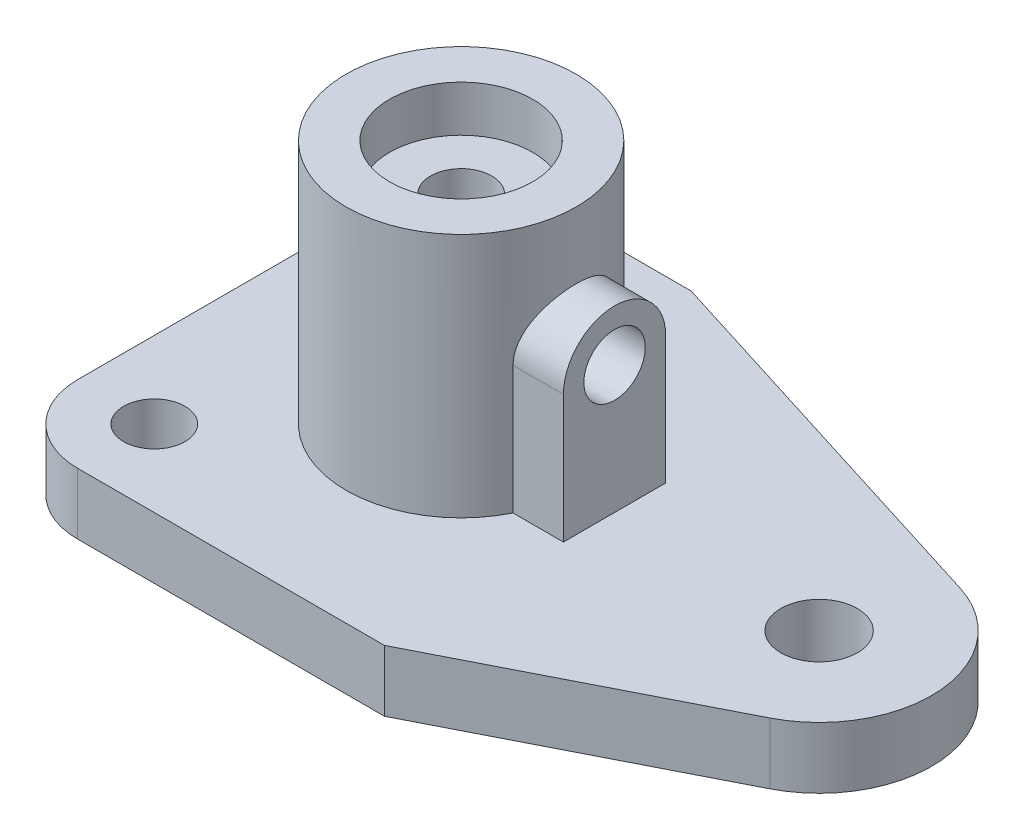
ISO-10303-21;
HEADER;
FILE_DESCRIPTION(('STEP AP214'),'2;1');
FILE_NAME('part.step','',(''),(''),'','','');
FILE_SCHEMA(('AUTOMOTIVE_DESIGN { 1 0 10303 214 1 1 1 1 }'));
ENDSEC;
DATA;
#1=APPLICATION_CONTEXT('core data for automotive mechanical design processes');
#2=APPLICATION_PROTOCOL_DEFINITION('international standard','automotive_design',2000,#1);
#3=PRODUCT_CONTEXT('',#1,'mechanical');
#4=PRODUCT('Part','Part','',(#3));
#5=PRODUCT_RELATED_PRODUCT_CATEGORY('part','',(#4));
#6=PRODUCT_DEFINITION_FORMATION('','',#4);
#7=PRODUCT_DEFINITION_CONTEXT('part definition',#1,'design');
#8=PRODUCT_DEFINITION('design','',#6,#7);
#9=PRODUCT_DEFINITION_SHAPE('','',#8);
#10=(LENGTH_UNIT() NAMED_UNIT(*) SI_UNIT(.MILLI.,.METRE.));
#11=(NAMED_UNIT(*) PLANE_ANGLE_UNIT() SI_UNIT($,.RADIAN.));
#12=(NAMED_UNIT(*) SI_UNIT($,.STERADIAN.) SOLID_ANGLE_UNIT());
#13=UNCERTAINTY_MEASURE_WITH_UNIT(LENGTH_MEASURE(1.E-05),#10,'distance_accuracy_value','');
#14=(GEOMETRIC_REPRESENTATION_CONTEXT(3) GLOBAL_UNCERTAINTY_ASSIGNED_CONTEXT((#13)) GLOBAL_UNIT_ASSIGNED_CONTEXT((#10,
#11,#12)) REPRESENTATION_CONTEXT('',''));
#15=CARTESIAN_POINT('',(0.,0.,0.));
#16=DIRECTION('',(0.,0.,1.));
#17=DIRECTION('',(1.,0.,0.));
#18=AXIS2_PLACEMENT_3D('',#15,#16,#17);
#19=CARTESIAN_POINT('',(-30.,12.,-30.));
#20=DIRECTION('',(0.,1.,0.));
#21=DIRECTION('',(0.,0.,1.));
#22=AXIS2_PLACEMENT_3D('',#19,#20,#21);
#23=PLANE('',#22);
#24=CARTESIAN_POINT('',(-30.,12.,30.));
#25=DIRECTION('',(0.,1.,0.));
#26=DIRECTION('',(0.,0.,1.));
#27=AXIS2_PLACEMENT_3D('',#24,#25,#26);
#28=CIRCLE('',#27,6.);
#29=CARTESIAN_POINT('',(-30.,12.,36.));
#30=VERTEX_POINT('',#29);
#31=EDGE_CURVE('E353',#30,#30,#28,.T.);
#32=ORIENTED_EDGE('',*,*,#31,.F.);
#33=EDGE_LOOP('',(#32));
#34=FACE_BOUND('',#33,.T.);
#35=CARTESIAN_POINT('',(-30.,12.,-30.));
#36=DIRECTION('',(0.,1.,0.));
#37=DIRECTION('',(0.,0.,1.));
#38=AXIS2_PLACEMENT_3D('',#35,#36,#37);
#39=CIRCLE('',#38,15.);
#40=CARTESIAN_POINT('',(-30.,12.,-45.));
#41=VERTEX_POINT('',#40);
#42=CARTESIAN_POINT('',(-45.,12.,-30.));
#43=VERTEX_POINT('',#42);
#44=EDGE_CURVE('E299',#41,#43,#39,.T.);
#45=ORIENTED_EDGE('',*,*,#44,.T.);
#46=DIRECTION('',(0.,0.,1.));
#47=VECTOR('',#46,1.);
#48=CARTESIAN_POINT('',(-45.,12.,-30.));
#49=LINE('',#48,#47);
#50=CARTESIAN_POINT('',(-45.,12.,30.));
#51=VERTEX_POINT('',#50);
#52=EDGE_CURVE('E333',#43,#51,#49,.T.);
#53=ORIENTED_EDGE('',*,*,#52,.T.);
#54=CARTESIAN_POINT('',(-30.,12.,30.));
#55=DIRECTION('',(0.,1.,0.));
#56=DIRECTION('',(0.,0.,1.));
#57=AXIS2_PLACEMENT_3D('',#54,#55,#56);
#58=CIRCLE('',#57,15.);
#59=CARTESIAN_POINT('',(-30.,12.,45.));
#60=VERTEX_POINT('',#59);
#61=EDGE_CURVE('E274',#51,#60,#58,.T.);
#62=ORIENTED_EDGE('',*,*,#61,.T.);
#63=DIRECTION('',(1.,0.,0.));
#64=VECTOR('',#63,1.);
#65=CARTESIAN_POINT('',(-30.,12.,45.));
#66=LINE('',#65,#64);
#67=CARTESIAN_POINT('',(30.,12.,45.));
#68=VERTEX_POINT('',#67);
#69=EDGE_CURVE('E324',#60,#68,#66,.T.);
#70=ORIENTED_EDGE('',*,*,#69,.T.);
#71=DIRECTION('',(0.891526897399263,0.,-0.452967759574171));
#72=VECTOR('',#71,1.);
#73=CARTESIAN_POINT('',(30.,12.,45.));
#74=LINE('',#73,#72);
#75=CARTESIAN_POINT('',(79.9652907106318,12.,19.6135917427838));
#76=VERTEX_POINT('',#75);
#77=EDGE_CURVE('E327',#68,#76,#74,.T.);
#78=ORIENTED_EDGE('',*,*,#77,.T.);
#79=CARTESIAN_POINT('',(70.,12.,0.));
#80=DIRECTION('',(0.,1.,0.));
#81=DIRECTION('',(0.,0.,1.));
#82=AXIS2_PLACEMENT_3D('',#79,#80,#81);
#83=CIRCLE('',#82,22.);
#84=CARTESIAN_POINT('',(76.5809794223601,12.,-20.9926346570046));
#85=VERTEX_POINT('',#84);
#86=EDGE_CURVE('E331',#76,#85,#83,.T.);
#87=ORIENTED_EDGE('',*,*,#86,.T.);
#88=DIRECTION('',(-0.954210666227484,0.,-0.299135428289097));
#89=VECTOR('',#88,1.);
#90=CARTESIAN_POINT('',(0.,12.,-45.));
#91=LINE('',#90,#89);
#92=CARTESIAN_POINT('',(0.,12.,-45.));
#93=VERTEX_POINT('',#92);
#94=EDGE_CURVE('E339',#85,#93,#91,.T.);
#95=ORIENTED_EDGE('',*,*,#94,.T.);
#96=DIRECTION('',(-1.,0.,0.));
#97=VECTOR('',#96,1.);
#98=CARTESIAN_POINT('',(-30.,12.,-45.));
#99=LINE('',#98,#97);
#100=EDGE_CURVE('E305',#93,#41,#99,.T.);
#101=ORIENTED_EDGE('',*,*,#100,.T.);
#102=EDGE_LOOP('',(#45,#53,#62,#70,#78,#87,#95,#101));
#103=FACE_BOUND('',#102,.T.);
#104=CARTESIAN_POINT('',(-30.,12.,-30.));
#105=DIRECTION('',(0.,1.,0.));
#106=DIRECTION('',(0.,0.,1.));
#107=AXIS2_PLACEMENT_3D('',#104,#105,#106);
#108=CIRCLE('',#107,6.);
#109=CARTESIAN_POINT('',(-30.,12.,-24.));
#110=VERTEX_POINT('',#109);
#111=EDGE_CURVE('E344',#110,#110,#108,.T.);
#112=ORIENTED_EDGE('',*,*,#111,.F.);
#113=EDGE_LOOP('',(#112));
#114=FACE_BOUND('',#113,.T.);
#115=CARTESIAN_POINT('',(70.,12.,0.));
#116=DIRECTION('',(0.,1.,0.));
#117=DIRECTION('',(0.,0.,1.));
#118=AXIS2_PLACEMENT_3D('',#115,#116,#117);
#119=CIRCLE('',#118,7.50000000000001);
#120=CARTESIAN_POINT('',(70.,12.,7.50000000000001));
#121=VERTEX_POINT('',#120);
#122=EDGE_CURVE('E413',#121,#121,#119,.T.);
#123=ORIENTED_EDGE('',*,*,#122,.F.);
#124=EDGE_LOOP('',(#123));
#125=FACE_BOUND('',#124,.T.);
#126=DIRECTION('',(0.,0.,-1.));
#127=VECTOR('',#126,1.);
#128=CARTESIAN_POINT('',(30.,12.,-30.));
#129=LINE('',#128,#127);
#130=CARTESIAN_POINT('',(30.,12.,9.99999999999999));
#131=VERTEX_POINT('',#130);
#132=CARTESIAN_POINT('',(30.,12.,-10.));
#133=VERTEX_POINT('',#132);
#134=EDGE_CURVE('E399',#131,#133,#129,.T.);
#135=ORIENTED_EDGE('',*,*,#134,.F.);
#136=DIRECTION('',(-1.,0.,0.));
#137=VECTOR('',#136,1.);
#138=CARTESIAN_POINT('',(-30.,12.,10.));
#139=LINE('',#138,#137);
#140=CARTESIAN_POINT('',(20.1556443707464,12.,10.));
#141=VERTEX_POINT('',#140);
#142=EDGE_CURVE('E372',#131,#141,#139,.T.);
#143=ORIENTED_EDGE('',*,*,#142,.T.);
#144=CARTESIAN_POINT('',(0.,12.,0.));
#145=DIRECTION('',(0.,1.,0.));
#146=DIRECTION('',(0.,0.,1.));
#147=AXIS2_PLACEMENT_3D('',#144,#145,#146);
#148=CIRCLE('',#147,22.5);
#149=CARTESIAN_POINT('',(20.1556443707464,12.,-10.));
#150=VERTEX_POINT('',#149);
#151=EDGE_CURVE('E157',#150,#141,#148,.T.);
#152=ORIENTED_EDGE('',*,*,#151,.F.);
#153=DIRECTION('',(1.,0.,0.));
#154=VECTOR('',#153,1.);
#155=CARTESIAN_POINT('',(-30.,12.,-10.));
#156=LINE('',#155,#154);
#157=EDGE_CURVE('E66',#150,#133,#156,.T.);
#158=ORIENTED_EDGE('',*,*,#157,.T.);
#159=EDGE_LOOP('',(#135,#143,#152,#158));
#160=FACE_BOUND('',#159,.T.);
#161=ADVANCED_FACE('F45',(#34,#103,#114,#125,#160),#23,.T.);
#162=CARTESIAN_POINT('',(0.,60.,0.));
#163=DIRECTION('',(0.,-1.,0.));
#164=DIRECTION('',(0.,0.,-1.));
#165=AXIS2_PLACEMENT_3D('',#162,#163,#164);
#166=CYLINDRICAL_SURFACE('',#165,22.5);
#167=CARTESIAN_POINT('',(0.,60.,0.));
#168=DIRECTION('',(0.,1.,0.));
#169=DIRECTION('',(0.,0.,1.));
#170=AXIS2_PLACEMENT_3D('',#167,#168,#169);
#171=CIRCLE('',#170,22.5);
#172=CARTESIAN_POINT('',(0.,60.,22.5));
#173=VERTEX_POINT('',#172);
#174=EDGE_CURVE('E162',#173,#173,#171,.T.);
#175=ORIENTED_EDGE('',*,*,#174,.F.);
#176=EDGE_LOOP('',(#175));
#177=FACE_BOUND('',#176,.T.);
#178=DIRECTION('',(0.,-1.,0.));
#179=VECTOR('',#178,1.);
#180=CARTESIAN_POINT('',(20.1556443707464,60.,10.));
#181=LINE('',#180,#179);
#182=CARTESIAN_POINT('',(20.1556443707464,37.,10.));
#183=VERTEX_POINT('',#182);
#184=EDGE_CURVE('E141',#183,#141,#181,.T.);
#185=ORIENTED_EDGE('',*,*,#184,.F.);
#186=CARTESIAN_POINT('',(20.1556443707464,37.,10.));
#187=CARTESIAN_POINT('',(20.1556467338138,36.7351067772332,9.99999788988471));
#188=CARTESIAN_POINT('',(20.1608844816626,36.4701410893671,9.9894597057784));
#189=CARTESIAN_POINT('',(20.1816582398332,35.9421708783214,9.94742186521064));
#190=CARTESIAN_POINT('',(20.197200378257,35.67916761639,9.91590973533557));
#191=CARTESIAN_POINT('',(20.2380772267664,35.1567092450034,9.8322123271914));
#192=CARTESIAN_POINT('',(20.2634311556789,34.8972621403407,9.77998647092334));
#193=CARTESIAN_POINT('',(20.3230772541673,34.3841930717982,9.65542798599881));
#194=CARTESIAN_POINT('',(20.3573732206293,34.1305736323055,9.58308681529258));
#195=CARTESIAN_POINT('',(20.4336051796327,33.6321256402333,9.41944147542666));
#196=CARTESIAN_POINT('',(20.4755027058478,33.387259938454,9.32823247178733));
#197=CARTESIAN_POINT('',(20.5657939530483,32.9063770088647,9.12744330969839));
#198=CARTESIAN_POINT('',(20.6141901609393,32.6703632129411,9.01785611429494));
#199=CARTESIAN_POINT('',(20.7670389316288,31.9778259276677,8.66293925993709));
#200=CARTESIAN_POINT('',(20.8792452228439,31.5362284050883,8.39126272338778));
#201=CARTESIAN_POINT('',(21.1204936950509,30.6748444768869,7.76492214778041));
#202=CARTESIAN_POINT('',(21.2501549255516,30.258300073361,7.40603685697128));
#203=CARTESIAN_POINT('',(21.4424229714565,29.6815055479928,6.82019003449962));
#204=CARTESIAN_POINT('',(21.5061859982244,29.497131007946,6.61682725277452));
#205=CARTESIAN_POINT('',(21.6313958255996,29.1454289187576,6.19523871841012));
#206=CARTESIAN_POINT('',(21.69284347198,28.9780951061117,5.97701847636072));
#207=CARTESIAN_POINT('',(21.8149320168583,28.6534417654312,5.5153100191777));
#208=CARTESIAN_POINT('',(21.8753710664174,28.4970715669028,5.27110035790201));
#209=CARTESIAN_POINT('',(21.9902793336661,28.205666076857,4.76905477068004));
#210=CARTESIAN_POINT('',(22.0447510299183,28.0706219171199,4.51122456853914));
#211=CARTESIAN_POINT('',(22.1461792191357,27.8230721031338,3.98357877187223));
#212=CARTESIAN_POINT('',(22.1931369123899,27.7105628484287,3.71376510040366));
#213=CARTESIAN_POINT('',(22.2781493230749,27.509253461446,3.16407617200313));
#214=CARTESIAN_POINT('',(22.3162047614496,27.4204514091725,2.88420173195578));
#215=CARTESIAN_POINT('',(22.3803223524604,27.2720486801381,2.33314810454131));
#216=CARTESIAN_POINT('',(22.4069538802533,27.2110486066769,2.0624117047011));
#217=CARTESIAN_POINT('',(22.4505388982579,27.1116889217879,1.5160434965299));
#218=CARTESIAN_POINT('',(22.4674927326792,27.0733285051265,1.2404118626689));
#219=CARTESIAN_POINT('',(22.4912293486071,27.0197206696435,0.686582910750691));
#220=CARTESIAN_POINT('',(22.4980161435632,27.0044641305162,0.408386648741023));
#221=CARTESIAN_POINT('',(22.5012326015306,26.9972262503561,-0.148362845264709));
#222=CARTESIAN_POINT('',(22.4976627340738,27.0052438541618,-0.426916060505579));
#223=CARTESIAN_POINT('',(22.4808759891807,27.04309082701,-0.962839008842262));
#224=CARTESIAN_POINT('',(22.4683434815083,27.0713731023444,-1.22034125820723));
#225=CARTESIAN_POINT('',(22.434716180397,27.1477076318452,-1.7318160885503));
#226=CARTESIAN_POINT('',(22.4136218604061,27.195758792841,-1.98578886389696));
#227=CARTESIAN_POINT('',(22.3633891330767,27.3111472123243,-2.48850286933622));
#228=CARTESIAN_POINT('',(22.3342504557785,27.3784851180563,-2.73724392355655));
#229=CARTESIAN_POINT('',(22.2686298481087,27.5318074090025,-3.22791060908472));
#230=CARTESIAN_POINT('',(22.2321476833476,27.617792389401,-3.46983602256979));
#231=CARTESIAN_POINT('',(22.152089692032,27.8090945370757,-3.94902407028346));
#232=CARTESIAN_POINT('',(22.1084156511136,27.9146823905874,-4.1861622939866));
#233=CARTESIAN_POINT('',(22.0153912871623,28.1434576528541,-4.65067318854916));
#234=CARTESIAN_POINT('',(21.9660389370878,28.2666513503626,-4.87804233201521));
#235=CARTESIAN_POINT('',(21.8111281064934,28.6612883291605,-5.54361691279589));
#236=CARTESIAN_POINT('',(21.6986645305337,28.9579059801247,-5.9655840826181));
#237=CARTESIAN_POINT('',(21.4560102664737,29.6366892347277,-6.7888322709015));
#238=CARTESIAN_POINT('',(21.3251210231804,30.0237461374228,-7.18588108317837));
#239=CARTESIAN_POINT('',(21.1314622446731,30.6495608251964,-7.72971892231944));
#240=CARTESIAN_POINT('',(21.0673155234338,30.8658547779007,-7.90246830871203));
#241=CARTESIAN_POINT('',(20.9415995919448,31.312599250194,-8.22983006499316));
#242=CARTESIAN_POINT('',(20.8800307166904,31.5430516001475,-8.3844400823172));
#243=CARTESIAN_POINT('',(20.758751421661,32.0267868622747,-8.68049085051104));
#244=CARTESIAN_POINT('',(20.6992275307664,32.2806220739585,-8.82110625775698));
#245=CARTESIAN_POINT('',(20.5868915444071,32.8006544573091,-9.08018899482053));
#246=CARTESIAN_POINT('',(20.5340764882043,33.0668461045243,-9.19866610564587));
#247=CARTESIAN_POINT('',(20.4370265474676,33.60981558618,-9.41231764127191));
#248=CARTESIAN_POINT('',(20.392787919955,33.8865887391473,-9.50750223631645));
#249=CARTESIAN_POINT('',(20.314561946013,34.4487547745452,-9.67352137812284));
#250=CARTESIAN_POINT('',(20.2805735316984,34.7341467556405,-9.74435846155888));
#251=CARTESIAN_POINT('',(20.2262278473527,35.2907597710347,-9.85663803179575));
#252=CARTESIAN_POINT('',(20.2050767139709,35.5615560667722,-9.8998047088277));
#253=CARTESIAN_POINT('',(20.1736108445027,36.1064042812481,-9.96376976967522));
#254=CARTESIAN_POINT('',(20.1632955865235,36.3804560425492,-9.98456923077345));
#255=CARTESIAN_POINT('',(20.1538999545394,36.9294307028715,-10.0035208156396));
#256=CARTESIAN_POINT('',(20.154815377589,37.2043532375104,-10.0016814117259));
#257=CARTESIAN_POINT('',(20.1678360860462,37.7528411180516,-9.97539993080949));
#258=CARTESIAN_POINT('',(20.1799409304055,38.0264065170203,-9.95095874469111));
#259=CARTESIAN_POINT('',(20.2135161213583,38.5488231272236,-9.88256441077222));
#260=CARTESIAN_POINT('',(20.2341874012781,38.7979457426185,-9.84027134984551));
#261=CARTESIAN_POINT('',(20.2840057086,39.2915496882637,-9.73716533443507));
#262=CARTESIAN_POINT('',(20.3131556224998,39.5360294076229,-9.67634607248892));
#263=CARTESIAN_POINT('',(20.3790442512744,40.0187100608811,-9.53679707059548));
#264=CARTESIAN_POINT('',(20.4157815494223,40.2569121575969,-9.45807067401518));
#265=CARTESIAN_POINT('',(20.4958187078979,40.7258548890386,-9.2833530815855));
#266=CARTESIAN_POINT('',(20.5391211448474,40.9565925508632,-9.18735510438002));
#267=CARTESIAN_POINT('',(20.6331633525949,41.4193914368704,-8.97422561510591));
#268=CARTESIAN_POINT('',(20.6841476326031,41.651058389966,-8.85634622667798));
#269=CARTESIAN_POINT('',(20.7906388494777,42.1038333959011,-8.60338132747131));
#270=CARTESIAN_POINT('',(20.8461477571085,42.3249367804073,-8.46828830447006));
#271=CARTESIAN_POINT('',(20.9602630980584,42.7554959091584,-8.18175708328124));
#272=CARTESIAN_POINT('',(21.0188700856417,42.9649495553492,-8.03031595523931));
#273=CARTESIAN_POINT('',(21.1377586527882,43.371230833598,-7.71194097990626));
#274=CARTESIAN_POINT('',(21.1980403200873,43.5680578023538,-7.54500631983705));
#275=CARTESIAN_POINT('',(21.3246451582659,43.9663086857042,-7.17985450750534));
#276=CARTESIAN_POINT('',(21.3909965976262,44.1663830691585,-6.98017224966624));
#277=CARTESIAN_POINT('',(21.5222238804823,44.5490677156752,-6.56440261282672));
#278=CARTESIAN_POINT('',(21.5871001979623,44.7316836506754,-6.34832060301987));
#279=CARTESIAN_POINT('',(21.7137146663014,45.0784576482457,-5.90073781503396));
#280=CARTESIAN_POINT('',(21.7754510028632,45.2426051045567,-5.66922829727787));
#281=CARTESIAN_POINT('',(21.8940700465457,45.5510564581777,-5.19230618617743));
#282=CARTESIAN_POINT('',(21.9509548511344,45.6953689474325,-4.94689967807606));
#283=CARTESIAN_POINT('',(22.0588299139297,45.9642221108373,-4.44132964839999));
#284=CARTESIAN_POINT('',(22.1097634782784,46.0885762693611,-4.1810546398633));
#285=CARTESIAN_POINT('',(22.2036947129601,46.3147543223198,-3.64948960259465));
#286=CARTESIAN_POINT('',(22.2466922459384,46.4165778268063,-3.37819938331353));
#287=CARTESIAN_POINT('',(22.3234599031495,46.5965350810062,-2.82676134304924));
#288=CARTESIAN_POINT('',(22.3572352143356,46.6746821500336,-2.54661860042782));
#289=CARTESIAN_POINT('',(22.4145569743246,46.8064208932378,-1.97959661993668));
#290=CARTESIAN_POINT('',(22.4381043259136,46.8600147346642,-1.692717978978));
#291=CARTESIAN_POINT('',(22.4728339117286,46.9387827905836,-1.1371454999443));
#292=CARTESIAN_POINT('',(22.4848339437628,46.9658397801123,-0.868768220564982));
#293=CARTESIAN_POINT('',(22.49918398273,46.9981745659679,-0.330452856118372));
#294=CARTESIAN_POINT('',(22.5015345151454,47.0034535482587,-0.0605148568448495));
#295=CARTESIAN_POINT('',(22.4965218101386,46.992172799855,0.478757546780382));
#296=CARTESIAN_POINT('',(22.4891604682379,46.9756173307141,0.748092058641848));
#297=CARTESIAN_POINT('',(22.4649286668168,46.9208680363648,1.28411610926064));
#298=CARTESIAN_POINT('',(22.4480583176503,46.8826744622707,1.55080567867646));
#299=CARTESIAN_POINT('',(22.4062221255858,46.7872639904234,2.06771118811459));
#300=CARTESIAN_POINT('',(22.3816514317179,46.7309727494295,2.31813095749895));
#301=CARTESIAN_POINT('',(22.3248320476295,46.5995643638601,2.81317832182088));
#302=CARTESIAN_POINT('',(22.2925806886456,46.5244406751869,3.05780387091359));
#303=CARTESIAN_POINT('',(22.2211700519152,46.3560785174868,3.53961949147704));
#304=CARTESIAN_POINT('',(22.1820125187124,46.2628446226121,3.77681142294876));
#305=CARTESIAN_POINT('',(22.0976591879738,46.058981881588,4.24258216784143));
#306=CARTESIAN_POINT('',(22.0524610878506,45.9483463993155,4.4711576539737));
#307=CARTESIAN_POINT('',(21.9548643697115,45.7051155409264,4.92859841084508));
#308=CARTESIAN_POINT('',(21.9022318232289,45.5717505092174,5.15700447949294));
#309=CARTESIAN_POINT('',(21.7926877628969,45.287846094391,5.60189892080378));
#310=CARTESIAN_POINT('',(21.7357747818329,45.1373008131273,5.818383162544));
#311=CARTESIAN_POINT('',(21.6189883380931,44.8200011252835,6.23833757112253));
#312=CARTESIAN_POINT('',(21.5591143342601,44.6532437503597,6.44180534336791));
#313=CARTESIAN_POINT('',(21.4377882534932,44.3044844240433,6.83472913899957));
#314=CARTESIAN_POINT('',(21.3763360932915,44.122481667114,7.02418442099565));
#315=CARTESIAN_POINT('',(21.2484097974618,43.7292027642688,7.40257086716319));
#316=CARTESIAN_POINT('',(21.1819226765392,43.5167498751481,7.590276755706));
#317=CARTESIAN_POINT('',(21.0506286657676,43.0764384775787,7.94714925759242));
#318=CARTESIAN_POINT('',(20.9858212534637,42.8485848408882,8.11632168970186));
#319=CARTESIAN_POINT('',(20.8596674630556,42.3783883021554,8.43526657622545));
#320=CARTESIAN_POINT('',(20.798324853763,42.1360301912847,8.58501812670279));
#321=CARTESIAN_POINT('',(20.6810875144462,41.6385107408398,8.86371677266268));
#322=CARTESIAN_POINT('',(20.6251903317933,41.383355244408,8.99267325158902));
#323=CARTESIAN_POINT('',(20.5204223278927,40.8605177675275,9.22925198454869));
#324=CARTESIAN_POINT('',(20.4715837641595,40.5927852560896,9.33677709633277));
#325=CARTESIAN_POINT('',(20.3830036854502,40.0477957201805,9.52860613159677));
#326=CARTESIAN_POINT('',(20.3432576156382,39.7705435449444,9.61292168610159));
#327=CARTESIAN_POINT('',(20.2744540432103,39.2092657837237,9.75719704321534));
#328=CARTESIAN_POINT('',(20.2453685035713,38.9252600875445,9.81722077692091));
#329=CARTESIAN_POINT('',(20.1989448055637,38.352312057745,9.91238948185889));
#330=CARTESIAN_POINT('',(20.1815978207776,38.0633736011315,9.94755314668912));
#331=CARTESIAN_POINT('',(20.1655429029449,37.6447393800361,9.98002857488445));
#332=CARTESIAN_POINT('',(20.1618347103411,37.5159423447458,9.98751472602665));
#333=CARTESIAN_POINT('',(20.1568848347925,37.2581026112733,9.99750102092719));
#334=CARTESIAN_POINT('',(20.1556432194249,37.1290599064573,10.0000010280795));
#335=CARTESIAN_POINT('',(20.1556443707464,37.,10.));
#336=B_SPLINE_CURVE_WITH_KNOTS('',3,(#186,#187,#188,#189,#190,#191,#192,#193,#194,#195,#196,
#197,#198,#199,#200,#201,#202,#203,#204,#205,#206,#207,#208,#209,#210,#211,#212,#213,#214,#215,
#216,#217,#218,#219,#220,#221,#222,#223,#224,#225,#226,#227,#228,#229,#230,#231,#232,#233,#234,
#235,#236,#237,#238,#239,#240,#241,#242,#243,#244,#245,#246,#247,#248,#249,#250,#251,#252,#253,
#254,#255,#256,#257,#258,#259,#260,#261,#262,#263,#264,#265,#266,#267,#268,#269,#270,#271,#272,
#273,#274,#275,#276,#277,#278,#279,#280,#281,#282,#283,#284,#285,#286,#287,#288,#289,#290,#291,
#292,#293,#294,#295,#296,#297,#298,#299,#300,#301,#302,#303,#304,#305,#306,#307,#308,#309,#310,
#311,#312,#313,#314,#315,#316,#317,#318,#319,#320,#321,#322,#323,#324,#325,#326,#327,#328,#329,
#330,#331,#332,#333,#334,#335),.UNSPECIFIED.,.T.,.F.,(4,2,2,2,2,2,2,2,2,2,2,2,2,2,2,2,2,2,2,2,2,
2,2,2,2,2,2,2,2,2,2,2,2,2,2,2,2,2,2,2,2,2,2,2,2,2,2,2,2,2,2,2,2,2,2,2,2,2,2,2,2,2,2,2,2,2,2,2,2,
2,2,2,2,2,4),(0.,0.79454598366116,1.58956491441372,2.38614903397939,3.18307194418878,
3.97606927706689,4.76937094238574,6.35414685016742,8.04110114663072,8.8857740316152,
9.73013531874934,10.6176638867956,11.504822407562,12.3918390716068,13.2787838762477,
14.114076963444,14.9493403396452,15.784273907791,16.6191696238023,17.3963151015551,
18.1734176108507,18.9505462020113,19.7276996015083,20.516512623991,21.3056081156004,
22.8828449625342,24.5840413585073,25.4357153849812,26.2874997465144,27.1750428438788,
28.0621928803463,28.9489548653087,29.8356244339034,30.659603228909,31.4835423364619,
32.3071731042592,33.1307714087576,33.8905016124852,34.650490764922,35.4103381392312,
36.1704845067572,36.9643087194601,37.7584805601155,38.5527949667081,39.3471510659663,
40.2172097801006,41.0869848602168,41.9572569208198,42.8271508081118,43.7047523008651,
44.5823689814847,45.4594910331812,46.3365356486669,47.145515439736,47.954451175643,
48.7632290503414,49.5719975392133,50.3446501244681,51.1175715722759,51.8902980541085,
52.6633199340981,53.4714833490813,54.2799250538284,55.0885150595102,55.8971478165159,
56.7697018395645,57.6419811256015,58.5151916438944,59.3880070306056,60.2646929065421,
61.1409386450096,62.0148630483932,62.8881296009241,63.2752335817631,63.6623481679963),.UNSPECIFIED.);
#337=CARTESIAN_POINT('',(20.1556443707464,37.,-10.));
#338=VERTEX_POINT('',#337);
#339=EDGE_CURVE('E174',#338,#183,#336,.T.);
#340=ORIENTED_EDGE('',*,*,#339,.F.);
#341=DIRECTION('',(0.,-1.,0.));
#342=VECTOR('',#341,1.);
#343=CARTESIAN_POINT('',(20.1556443707464,60.,-10.));
#344=LINE('',#343,#342);
#345=EDGE_CURVE('E170',#150,#338,#344,.F.);
#346=ORIENTED_EDGE('',*,*,#345,.F.);
#347=ORIENTED_EDGE('',*,*,#151,.T.);
#348=EDGE_LOOP('',(#185,#340,#346,#347));
#349=FACE_BOUND('',#348,.T.);
#350=ADVANCED_FACE('F183',(#177,#349),#166,.T.);
#351=CARTESIAN_POINT('',(-30.,0.,-30.));
#352=DIRECTION('',(0.,1.,0.));
#353=DIRECTION('',(0.,0.,1.));
#354=AXIS2_PLACEMENT_3D('',#351,#352,#353);
#355=PLANE('',#354);
#356=CARTESIAN_POINT('',(0.,0.,0.));
#357=DIRECTION('',(0.,1.,0.));
#358=DIRECTION('',(0.,0.,1.));
#359=AXIS2_PLACEMENT_3D('',#356,#357,#358);
#360=CIRCLE('',#359,6.00000000000001);
#361=CARTESIAN_POINT('',(0.,0.,6.00000000000001));
#362=VERTEX_POINT('',#361);
#363=EDGE_CURVE('E154',#362,#362,#360,.T.);
#364=ORIENTED_EDGE('',*,*,#363,.T.);
#365=EDGE_LOOP('',(#364));
#366=FACE_BOUND('',#365,.T.);
#367=CARTESIAN_POINT('',(-30.,0.,-30.));
#368=DIRECTION('',(0.,1.,0.));
#369=DIRECTION('',(0.,0.,1.));
#370=AXIS2_PLACEMENT_3D('',#367,#368,#369);
#371=CIRCLE('',#370,15.);
#372=CARTESIAN_POINT('',(-30.,0.,-45.));
#373=VERTEX_POINT('',#372);
#374=CARTESIAN_POINT('',(-45.,0.,-30.));
#375=VERTEX_POINT('',#374);
#376=EDGE_CURVE('E270',#373,#375,#371,.T.);
#377=ORIENTED_EDGE('',*,*,#376,.F.);
#378=DIRECTION('',(-1.,0.,0.));
#379=VECTOR('',#378,1.);
#380=CARTESIAN_POINT('',(-30.,0.,-45.));
#381=LINE('',#380,#379);
#382=CARTESIAN_POINT('',(0.,0.,-45.));
#383=VERTEX_POINT('',#382);
#384=EDGE_CURVE('E296',#383,#373,#381,.T.);
#385=ORIENTED_EDGE('',*,*,#384,.F.);
#386=DIRECTION('',(-0.954210666227484,0.,-0.299135428289097));
#387=VECTOR('',#386,1.);
#388=CARTESIAN_POINT('',(0.,0.,-45.));
#389=LINE('',#388,#387);
#390=CARTESIAN_POINT('',(76.5809794223601,0.,-20.9926346570046));
#391=VERTEX_POINT('',#390);
#392=EDGE_CURVE('E293',#391,#383,#389,.T.);
#393=ORIENTED_EDGE('',*,*,#392,.F.);
#394=CARTESIAN_POINT('',(70.,0.,0.));
#395=DIRECTION('',(0.,1.,0.));
#396=DIRECTION('',(0.,0.,1.));
#397=AXIS2_PLACEMENT_3D('',#394,#395,#396);
#398=CIRCLE('',#397,22.);
#399=CARTESIAN_POINT('',(79.9652907106318,0.,19.6135917427838));
#400=VERTEX_POINT('',#399);
#401=EDGE_CURVE('E290',#400,#391,#398,.T.);
#402=ORIENTED_EDGE('',*,*,#401,.F.);
#403=DIRECTION('',(0.891526897399263,0.,-0.452967759574171));
#404=VECTOR('',#403,1.);
#405=CARTESIAN_POINT('',(30.,0.,45.));
#406=LINE('',#405,#404);
#407=CARTESIAN_POINT('',(30.,0.,45.));
#408=VERTEX_POINT('',#407);
#409=EDGE_CURVE('E284',#408,#400,#406,.T.);
#410=ORIENTED_EDGE('',*,*,#409,.F.);
#411=DIRECTION('',(1.,0.,0.));
#412=VECTOR('',#411,1.);
#413=CARTESIAN_POINT('',(-30.,0.,45.));
#414=LINE('',#413,#412);
#415=CARTESIAN_POINT('',(-30.,0.,45.));
#416=VERTEX_POINT('',#415);
#417=EDGE_CURVE('E280',#416,#408,#414,.T.);
#418=ORIENTED_EDGE('',*,*,#417,.F.);
#419=CARTESIAN_POINT('',(-30.,0.,30.));
#420=DIRECTION('',(0.,1.,0.));
#421=DIRECTION('',(0.,0.,1.));
#422=AXIS2_PLACEMENT_3D('',#419,#420,#421);
#423=CIRCLE('',#422,15.);
#424=CARTESIAN_POINT('',(-45.,0.,30.));
#425=VERTEX_POINT('',#424);
#426=EDGE_CURVE('E269',#425,#416,#423,.T.);
#427=ORIENTED_EDGE('',*,*,#426,.F.);
#428=DIRECTION('',(0.,0.,1.));
#429=VECTOR('',#428,1.);
#430=CARTESIAN_POINT('',(-45.,0.,-30.));
#431=LINE('',#430,#429);
#432=EDGE_CURVE('E259',#375,#425,#431,.T.);
#433=ORIENTED_EDGE('',*,*,#432,.F.);
#434=EDGE_LOOP('',(#377,#385,#393,#402,#410,#418,#427,#433));
#435=FACE_BOUND('',#434,.T.);
#436=CARTESIAN_POINT('',(-30.,0.,-30.));
#437=DIRECTION('',(0.,1.,0.));
#438=DIRECTION('',(0.,0.,1.));
#439=AXIS2_PLACEMENT_3D('',#436,#437,#438);
#440=CIRCLE('',#439,6.);
#441=CARTESIAN_POINT('',(-30.,0.,-24.));
#442=VERTEX_POINT('',#441);
#443=EDGE_CURVE('E347',#442,#442,#440,.T.);
#444=ORIENTED_EDGE('',*,*,#443,.T.);
#445=EDGE_LOOP('',(#444));
#446=FACE_BOUND('',#445,.T.);
#447=CARTESIAN_POINT('',(-30.,0.,30.));
#448=DIRECTION('',(0.,1.,0.));
#449=DIRECTION('',(0.,0.,1.));
#450=AXIS2_PLACEMENT_3D('',#447,#448,#449);
#451=CIRCLE('',#450,6.);
#452=CARTESIAN_POINT('',(-30.,0.,36.));
#453=VERTEX_POINT('',#452);
#454=EDGE_CURVE('E356',#453,#453,#451,.T.);
#455=ORIENTED_EDGE('',*,*,#454,.T.);
#456=EDGE_LOOP('',(#455));
#457=FACE_BOUND('',#456,.T.);
#458=CARTESIAN_POINT('',(70.,0.,0.));
#459=DIRECTION('',(0.,1.,0.));
#460=DIRECTION('',(0.,0.,1.));
#461=AXIS2_PLACEMENT_3D('',#458,#459,#460);
#462=CIRCLE('',#461,7.50000000000001);
#463=CARTESIAN_POINT('',(70.,0.,7.50000000000001));
#464=VERTEX_POINT('',#463);
#465=EDGE_CURVE('E411',#464,#464,#462,.T.);
#466=ORIENTED_EDGE('',*,*,#465,.T.);
#467=EDGE_LOOP('',(#466));
#468=FACE_BOUND('',#467,.T.);
#469=ADVANCED_FACE('F217',(#366,#435,#446,#457,#468),#355,.F.);
#470=CARTESIAN_POINT('',(-30.,12.,-30.));
#471=DIRECTION('',(0.,-1.,0.));
#472=DIRECTION('',(0.,0.,-1.));
#473=AXIS2_PLACEMENT_3D('',#470,#471,#472);
#474=CYLINDRICAL_SURFACE('',#473,15.);
#475=ORIENTED_EDGE('',*,*,#376,.T.);
#476=DIRECTION('',(0.,-1.,0.));
#477=VECTOR('',#476,1.);
#478=CARTESIAN_POINT('',(-45.,12.,-30.));
#479=LINE('',#478,#477);
#480=EDGE_CURVE('E168',#43,#375,#479,.T.);
#481=ORIENTED_EDGE('',*,*,#480,.F.);
#482=ORIENTED_EDGE('',*,*,#44,.F.);
#483=DIRECTION('',(0.,-1.,0.));
#484=VECTOR('',#483,1.);
#485=CARTESIAN_POINT('',(-30.,12.,-45.));
#486=LINE('',#485,#484);
#487=EDGE_CURVE('E300',#41,#373,#486,.T.);
#488=ORIENTED_EDGE('',*,*,#487,.T.);
#489=EDGE_LOOP('',(#475,#481,#482,#488));
#490=FACE_BOUND('',#489,.T.);
#491=ADVANCED_FACE('F47',(#490),#474,.T.);
#492=CARTESIAN_POINT('',(-45.,12.,-30.));
#493=DIRECTION('',(1.,0.,0.));
#494=DIRECTION('',(0.,0.,-1.));
#495=AXIS2_PLACEMENT_3D('',#492,#493,#494);
#496=PLANE('',#495);
#497=ORIENTED_EDGE('',*,*,#432,.T.);
#498=DIRECTION('',(0.,-1.,0.));
#499=VECTOR('',#498,1.);
#500=CARTESIAN_POINT('',(-45.,12.,30.));
#501=LINE('',#500,#499);
#502=EDGE_CURVE('E261',#51,#425,#501,.T.);
#503=ORIENTED_EDGE('',*,*,#502,.F.);
#504=ORIENTED_EDGE('',*,*,#52,.F.);
#505=ORIENTED_EDGE('',*,*,#480,.T.);
#506=EDGE_LOOP('',(#497,#503,#504,#505));
#507=FACE_BOUND('',#506,.T.);
#508=ADVANCED_FACE('F249',(#507),#496,.F.);
#509=CARTESIAN_POINT('',(-30.,12.,30.));
#510=DIRECTION('',(0.,-1.,0.));
#511=DIRECTION('',(0.,0.,-1.));
#512=AXIS2_PLACEMENT_3D('',#509,#510,#511);
#513=CYLINDRICAL_SURFACE('',#512,15.);
#514=ORIENTED_EDGE('',*,*,#426,.T.);
#515=DIRECTION('',(0.,-1.,0.));
#516=VECTOR('',#515,1.);
#517=CARTESIAN_POINT('',(-30.,12.,45.));
#518=LINE('',#517,#516);
#519=EDGE_CURVE('E276',#60,#416,#518,.T.);
#520=ORIENTED_EDGE('',*,*,#519,.F.);
#521=ORIENTED_EDGE('',*,*,#61,.F.);
#522=ORIENTED_EDGE('',*,*,#502,.T.);
#523=EDGE_LOOP('',(#514,#520,#521,#522));
#524=FACE_BOUND('',#523,.T.);
#525=ADVANCED_FACE('F246',(#524),#513,.T.);
#526=CARTESIAN_POINT('',(-30.,12.,45.));
#527=DIRECTION('',(0.,0.,-1.));
#528=DIRECTION('',(-1.,0.,0.));
#529=AXIS2_PLACEMENT_3D('',#526,#527,#528);
#530=PLANE('',#529);
#531=ORIENTED_EDGE('',*,*,#417,.T.);
#532=DIRECTION('',(0.,-1.,0.));
#533=VECTOR('',#532,1.);
#534=CARTESIAN_POINT('',(30.,12.,45.));
#535=LINE('',#534,#533);
#536=EDGE_CURVE('E317',#68,#408,#535,.T.);
#537=ORIENTED_EDGE('',*,*,#536,.F.);
#538=ORIENTED_EDGE('',*,*,#69,.F.);
#539=ORIENTED_EDGE('',*,*,#519,.T.);
#540=EDGE_LOOP('',(#531,#537,#538,#539));
#541=FACE_BOUND('',#540,.T.);
#542=ADVANCED_FACE('F242',(#541),#530,.F.);
#543=CARTESIAN_POINT('',(30.,12.,45.));
#544=DIRECTION('',(-0.452967759574171,0.,-0.891526897399263));
#545=DIRECTION('',(-0.891526897399263,0.,0.452967759574171));
#546=AXIS2_PLACEMENT_3D('',#543,#544,#545);
#547=PLANE('',#546);
#548=ORIENTED_EDGE('',*,*,#409,.T.);
#549=DIRECTION('',(0.,-1.,0.));
#550=VECTOR('',#549,1.);
#551=CARTESIAN_POINT('',(79.9652907106318,12.,19.6135917427838));
#552=LINE('',#551,#550);
#553=EDGE_CURVE('E313',#76,#400,#552,.T.);
#554=ORIENTED_EDGE('',*,*,#553,.F.);
#555=ORIENTED_EDGE('',*,*,#77,.F.);
#556=ORIENTED_EDGE('',*,*,#536,.T.);
#557=EDGE_LOOP('',(#548,#554,#555,#556));
#558=FACE_BOUND('',#557,.T.);
#559=ADVANCED_FACE('F238',(#558),#547,.F.);
#560=CARTESIAN_POINT('',(70.,12.,0.));
#561=DIRECTION('',(0.,-1.,0.));
#562=DIRECTION('',(0.,0.,-1.));
#563=AXIS2_PLACEMENT_3D('',#560,#561,#562);
#564=CYLINDRICAL_SURFACE('',#563,22.);
#565=ORIENTED_EDGE('',*,*,#401,.T.);
#566=DIRECTION('',(0.,-1.,0.));
#567=VECTOR('',#566,1.);
#568=CARTESIAN_POINT('',(76.5809794223601,12.,-20.9926346570046));
#569=LINE('',#568,#567);
#570=EDGE_CURVE('E309',#85,#391,#569,.T.);
#571=ORIENTED_EDGE('',*,*,#570,.F.);
#572=ORIENTED_EDGE('',*,*,#86,.F.);
#573=ORIENTED_EDGE('',*,*,#553,.T.);
#574=EDGE_LOOP('',(#565,#571,#572,#573));
#575=FACE_BOUND('',#574,.T.);
#576=ADVANCED_FACE('F234',(#575),#564,.T.);
#577=CARTESIAN_POINT('',(0.,12.,-45.));
#578=DIRECTION('',(-0.299135428289097,0.,0.954210666227484));
#579=DIRECTION('',(0.954210666227484,0.,0.299135428289097));
#580=AXIS2_PLACEMENT_3D('',#577,#578,#579);
#581=PLANE('',#580);
#582=ORIENTED_EDGE('',*,*,#392,.T.);
#583=DIRECTION('',(0.,-1.,0.));
#584=VECTOR('',#583,1.);
#585=CARTESIAN_POINT('',(0.,12.,-45.));
#586=LINE('',#585,#584);
#587=EDGE_CURVE('E304',#93,#383,#586,.T.);
#588=ORIENTED_EDGE('',*,*,#587,.F.);
#589=ORIENTED_EDGE('',*,*,#94,.F.);
#590=ORIENTED_EDGE('',*,*,#570,.T.);
#591=EDGE_LOOP('',(#582,#588,#589,#590));
#592=FACE_BOUND('',#591,.T.);
#593=ADVANCED_FACE('F230',(#592),#581,.F.);
#594=CARTESIAN_POINT('',(-30.,12.,-45.));
#595=DIRECTION('',(0.,0.,1.));
#596=DIRECTION('',(1.,0.,0.));
#597=AXIS2_PLACEMENT_3D('',#594,#595,#596);
#598=PLANE('',#597);
#599=ORIENTED_EDGE('',*,*,#384,.T.);
#600=ORIENTED_EDGE('',*,*,#487,.F.);
#601=ORIENTED_EDGE('',*,*,#100,.F.);
#602=ORIENTED_EDGE('',*,*,#587,.T.);
#603=EDGE_LOOP('',(#599,#600,#601,#602));
#604=FACE_BOUND('',#603,.T.);
#605=ADVANCED_FACE('F227',(#604),#598,.F.);
#606=CARTESIAN_POINT('',(-30.,12.,-30.));
#607=DIRECTION('',(0.,-1.,0.));
#608=DIRECTION('',(0.,0.,-1.));
#609=AXIS2_PLACEMENT_3D('',#606,#607,#608);
#610=CYLINDRICAL_SURFACE('',#609,6.);
#611=ORIENTED_EDGE('',*,*,#111,.T.);
#612=EDGE_LOOP('',(#611));
#613=FACE_BOUND('',#612,.T.);
#614=ORIENTED_EDGE('',*,*,#443,.F.);
#615=EDGE_LOOP('',(#614));
#616=FACE_BOUND('',#615,.T.);
#617=ADVANCED_FACE('F223',(#613,#616),#610,.F.);
#618=CARTESIAN_POINT('',(-30.,12.,30.));
#619=DIRECTION('',(0.,-1.,0.));
#620=DIRECTION('',(0.,0.,-1.));
#621=AXIS2_PLACEMENT_3D('',#618,#619,#620);
#622=CYLINDRICAL_SURFACE('',#621,6.);
#623=ORIENTED_EDGE('',*,*,#31,.T.);
#624=EDGE_LOOP('',(#623));
#625=FACE_BOUND('',#624,.T.);
#626=ORIENTED_EDGE('',*,*,#454,.F.);
#627=EDGE_LOOP('',(#626));
#628=FACE_BOUND('',#627,.T.);
#629=ADVANCED_FACE('F207',(#625,#628),#622,.F.);
#630=CARTESIAN_POINT('',(70.,12.,0.));
#631=DIRECTION('',(0.,-1.,0.));
#632=DIRECTION('',(0.,0.,-1.));
#633=AXIS2_PLACEMENT_3D('',#630,#631,#632);
#634=CYLINDRICAL_SURFACE('',#633,7.50000000000001);
#635=ORIENTED_EDGE('',*,*,#122,.T.);
#636=EDGE_LOOP('',(#635));
#637=FACE_BOUND('',#636,.T.);
#638=ORIENTED_EDGE('',*,*,#465,.F.);
#639=EDGE_LOOP('',(#638));
#640=FACE_BOUND('',#639,.T.);
#641=ADVANCED_FACE('F202',(#637,#640),#634,.F.);
#642=CARTESIAN_POINT('',(0.,60.,0.));
#643=DIRECTION('',(0.,1.,0.));
#644=DIRECTION('',(0.,0.,1.));
#645=AXIS2_PLACEMENT_3D('',#642,#643,#644);
#646=PLANE('',#645);
#647=CARTESIAN_POINT('',(0.,60.,0.));
#648=DIRECTION('',(0.,1.,0.));
#649=DIRECTION('',(0.,0.,1.));
#650=AXIS2_PLACEMENT_3D('',#647,#648,#649);
#651=CIRCLE('',#650,14.);
#652=CARTESIAN_POINT('',(0.,60.,14.));
#653=VERTEX_POINT('',#652);
#654=EDGE_CURVE('E402',#653,#653,#651,.T.);
#655=ORIENTED_EDGE('',*,*,#654,.F.);
#656=EDGE_LOOP('',(#655));
#657=FACE_BOUND('',#656,.T.);
#658=ORIENTED_EDGE('',*,*,#174,.T.);
#659=EDGE_LOOP('',(#658));
#660=FACE_BOUND('',#659,.T.);
#661=ADVANCED_FACE('F146',(#657,#660),#646,.T.);
#662=CARTESIAN_POINT('',(0.,60.,0.));
#663=DIRECTION('',(0.,1.,0.));
#664=DIRECTION('',(0.,0.,1.));
#665=AXIS2_PLACEMENT_3D('',#662,#663,#664);
#666=CYLINDRICAL_SURFACE('',#665,6.00000000000001);
#667=CARTESIAN_POINT('',(0.,37.,0.));
#668=DIRECTION('',(-0.707106781186547,0.707106781186547,0.));
#669=DIRECTION('',(0.707106781186547,0.707106781186547,0.));
#670=AXIS2_PLACEMENT_3D('',#667,#668,#669);
#671=ELLIPSE('',#670,8.48528137423858,6.00000000000001);
#672=CARTESIAN_POINT('',(0.,37.,-6.00000000000001));
#673=VERTEX_POINT('',#672);
#674=CARTESIAN_POINT('',(0.,37.,6.00000000000001));
#675=VERTEX_POINT('',#674);
#676=EDGE_CURVE('E54',#673,#675,#671,.F.);
#677=ORIENTED_EDGE('',*,*,#676,.T.);
#678=CARTESIAN_POINT('',(0.,37.,0.));
#679=DIRECTION('',(0.707106781186547,0.707106781186547,0.));
#680=DIRECTION('',(-0.707106781186547,0.707106781186547,0.));
#681=AXIS2_PLACEMENT_3D('',#678,#679,#680);
#682=ELLIPSE('',#681,8.48528137423858,6.00000000000001);
#683=EDGE_CURVE('E11',#675,#673,#682,.T.);
#684=ORIENTED_EDGE('',*,*,#683,.T.);
#685=EDGE_LOOP('',(#677,#684));
#686=FACE_BOUND('',#685,.T.);
#687=CARTESIAN_POINT('',(0.,51.,0.));
#688=DIRECTION('',(0.,1.,0.));
#689=DIRECTION('',(0.,0.,1.));
#690=AXIS2_PLACEMENT_3D('',#687,#688,#689);
#691=CIRCLE('',#690,6.00000000000001);
#692=CARTESIAN_POINT('',(0.,51.,6.00000000000001));
#693=VERTEX_POINT('',#692);
#694=EDGE_CURVE('E151',#693,#693,#691,.T.);
#695=ORIENTED_EDGE('',*,*,#694,.T.);
#696=EDGE_LOOP('',(#695));
#697=FACE_BOUND('',#696,.T.);
#698=ORIENTED_EDGE('',*,*,#363,.F.);
#699=EDGE_LOOP('',(#698));
#700=FACE_BOUND('',#699,.T.);
#701=ADVANCED_FACE('F142',(#686,#697,#700),#666,.F.);
#702=CARTESIAN_POINT('',(6.00000000000001,51.,0.));
#703=DIRECTION('',(0.,-1.,0.));
#704=DIRECTION('',(0.,0.,-1.));
#705=AXIS2_PLACEMENT_3D('',#702,#703,#704);
#706=PLANE('',#705);
#707=ORIENTED_EDGE('',*,*,#694,.F.);
#708=EDGE_LOOP('',(#707));
#709=FACE_BOUND('',#708,.T.);
#710=CARTESIAN_POINT('',(0.,51.,0.));
#711=DIRECTION('',(0.,1.,0.));
#712=DIRECTION('',(0.,0.,1.));
#713=AXIS2_PLACEMENT_3D('',#710,#711,#712);
#714=CIRCLE('',#713,14.);
#715=CARTESIAN_POINT('',(0.,51.,14.));
#716=VERTEX_POINT('',#715);
#717=EDGE_CURVE('E164',#716,#716,#714,.T.);
#718=ORIENTED_EDGE('',*,*,#717,.T.);
#719=EDGE_LOOP('',(#718));
#720=FACE_BOUND('',#719,.T.);
#721=ADVANCED_FACE('F145',(#709,#720),#706,.F.);
#722=CARTESIAN_POINT('',(0.,60.,0.));
#723=DIRECTION('',(0.,1.,0.));
#724=DIRECTION('',(0.,0.,1.));
#725=AXIS2_PLACEMENT_3D('',#722,#723,#724);
#726=CYLINDRICAL_SURFACE('',#725,14.);
#727=ORIENTED_EDGE('',*,*,#717,.F.);
#728=EDGE_LOOP('',(#727));
#729=FACE_BOUND('',#728,.T.);
#730=ORIENTED_EDGE('',*,*,#654,.T.);
#731=EDGE_LOOP('',(#730));
#732=FACE_BOUND('',#731,.T.);
#733=ADVANCED_FACE('F193',(#729,#732),#726,.F.);
#734=CARTESIAN_POINT('',(30.,37.,0.));
#735=DIRECTION('',(-1.,0.,0.));
#736=DIRECTION('',(0.,0.,1.));
#737=AXIS2_PLACEMENT_3D('',#734,#735,#736);
#738=CYLINDRICAL_SURFACE('',#737,10.);
#739=DIRECTION('',(-1.,0.,0.));
#740=VECTOR('',#739,1.);
#741=CARTESIAN_POINT('',(30.,37.,-10.));
#742=LINE('',#741,#740);
#743=CARTESIAN_POINT('',(30.,37.,-10.));
#744=VERTEX_POINT('',#743);
#745=EDGE_CURVE('E380',#744,#338,#742,.T.);
#746=ORIENTED_EDGE('',*,*,#745,.T.);
#747=ORIENTED_EDGE('',*,*,#339,.T.);
#748=DIRECTION('',(-1.,0.,0.));
#749=VECTOR('',#748,1.);
#750=CARTESIAN_POINT('',(30.,37.,10.));
#751=LINE('',#750,#749);
#752=CARTESIAN_POINT('',(30.,37.,10.));
#753=VERTEX_POINT('',#752);
#754=EDGE_CURVE('E375',#753,#183,#751,.T.);
#755=ORIENTED_EDGE('',*,*,#754,.F.);
#756=CARTESIAN_POINT('',(30.,37.,0.));
#757=DIRECTION('',(1.,0.,0.));
#758=DIRECTION('',(0.,0.,-1.));
#759=AXIS2_PLACEMENT_3D('',#756,#757,#758);
#760=CIRCLE('',#759,10.);
#761=EDGE_CURVE('E382',#744,#753,#760,.T.);
#762=ORIENTED_EDGE('',*,*,#761,.F.);
#763=EDGE_LOOP('',(#746,#747,#755,#762));
#764=FACE_BOUND('',#763,.T.);
#765=ADVANCED_FACE('F187',(#764),#738,.T.);
#766=CARTESIAN_POINT('',(30.,37.,10.));
#767=DIRECTION('',(0.,0.,-1.));
#768=DIRECTION('',(0.,1.,0.));
#769=AXIS2_PLACEMENT_3D('',#766,#767,#768);
#770=PLANE('',#769);
#771=ORIENTED_EDGE('',*,*,#142,.F.);
#772=DIRECTION('',(0.,-1.,0.));
#773=VECTOR('',#772,1.);
#774=CARTESIAN_POINT('',(30.,37.,10.));
#775=LINE('',#774,#773);
#776=EDGE_CURVE('E391',#753,#131,#775,.T.);
#777=ORIENTED_EDGE('',*,*,#776,.F.);
#778=ORIENTED_EDGE('',*,*,#754,.T.);
#779=ORIENTED_EDGE('',*,*,#184,.T.);
#780=EDGE_LOOP('',(#771,#777,#778,#779));
#781=FACE_BOUND('',#780,.T.);
#782=ADVANCED_FACE('F192',(#781),#770,.F.);
#783=CARTESIAN_POINT('',(30.,0.,-10.));
#784=DIRECTION('',(0.,0.,1.));
#785=DIRECTION('',(0.,-1.,0.));
#786=AXIS2_PLACEMENT_3D('',#783,#784,#785);
#787=PLANE('',#786);
#788=ORIENTED_EDGE('',*,*,#157,.F.);
#789=ORIENTED_EDGE('',*,*,#345,.T.);
#790=ORIENTED_EDGE('',*,*,#745,.F.);
#791=DIRECTION('',(0.,1.,0.));
#792=VECTOR('',#791,1.);
#793=CARTESIAN_POINT('',(30.,0.,-10.));
#794=LINE('',#793,#792);
#795=EDGE_CURVE('E386',#133,#744,#794,.T.);
#796=ORIENTED_EDGE('',*,*,#795,.F.);
#797=EDGE_LOOP('',(#788,#789,#790,#796));
#798=FACE_BOUND('',#797,.T.);
#799=ADVANCED_FACE('F498',(#798),#787,.F.);
#800=CARTESIAN_POINT('',(30.,37.,0.));
#801=DIRECTION('',(1.,0.,0.));
#802=DIRECTION('',(0.,0.,-1.));
#803=AXIS2_PLACEMENT_3D('',#800,#801,#802);
#804=PLANE('',#803);
#805=CARTESIAN_POINT('',(30.,37.,0.));
#806=DIRECTION('',(1.,0.,0.));
#807=DIRECTION('',(0.,0.,-1.));
#808=AXIS2_PLACEMENT_3D('',#805,#806,#807);
#809=CIRCLE('',#808,6.00000000000001);
#810=CARTESIAN_POINT('',(30.,37.,-6.00000000000001));
#811=VERTEX_POINT('',#810);
#812=EDGE_CURVE('E576',#811,#811,#809,.T.);
#813=ORIENTED_EDGE('',*,*,#812,.F.);
#814=EDGE_LOOP('',(#813));
#815=FACE_BOUND('',#814,.T.);
#816=ORIENTED_EDGE('',*,*,#776,.T.);
#817=ORIENTED_EDGE('',*,*,#134,.T.);
#818=ORIENTED_EDGE('',*,*,#795,.T.);
#819=ORIENTED_EDGE('',*,*,#761,.T.);
#820=EDGE_LOOP('',(#816,#817,#818,#819));
#821=FACE_BOUND('',#820,.T.);
#822=ADVANCED_FACE('F504',(#815,#821),#804,.T.);
#823=CARTESIAN_POINT('',(30.,37.,0.));
#824=DIRECTION('',(1.,0.,0.));
#825=DIRECTION('',(0.,0.,-1.));
#826=AXIS2_PLACEMENT_3D('',#823,#824,#825);
#827=CYLINDRICAL_SURFACE('',#826,6.00000000000001);
#828=ORIENTED_EDGE('',*,*,#676,.F.);
#829=ORIENTED_EDGE('',*,*,#683,.F.);
#830=EDGE_LOOP('',(#828,#829));
#831=FACE_BOUND('',#830,.T.);
#832=ORIENTED_EDGE('',*,*,#812,.T.);
#833=EDGE_LOOP('',(#832));
#834=FACE_BOUND('',#833,.T.);
#835=ADVANCED_FACE('F137',(#831,#834),#827,.F.);
#836=CLOSED_SHELL('',(#161,#350,#469,#491,#508,#525,#542,#559,#576,#593,#605,#617,#629,#641,
#661,#701,#721,#733,#765,#782,#799,#822,#835));
#837=MANIFOLD_SOLID_BREP('B2',#836);
#838=ADVANCED_BREP_SHAPE_REPRESENTATION('',(#18,#837),#14);
#839=SHAPE_DEFINITION_REPRESENTATION(#9,#838);
ENDSEC;
END-ISO-10303-21;
